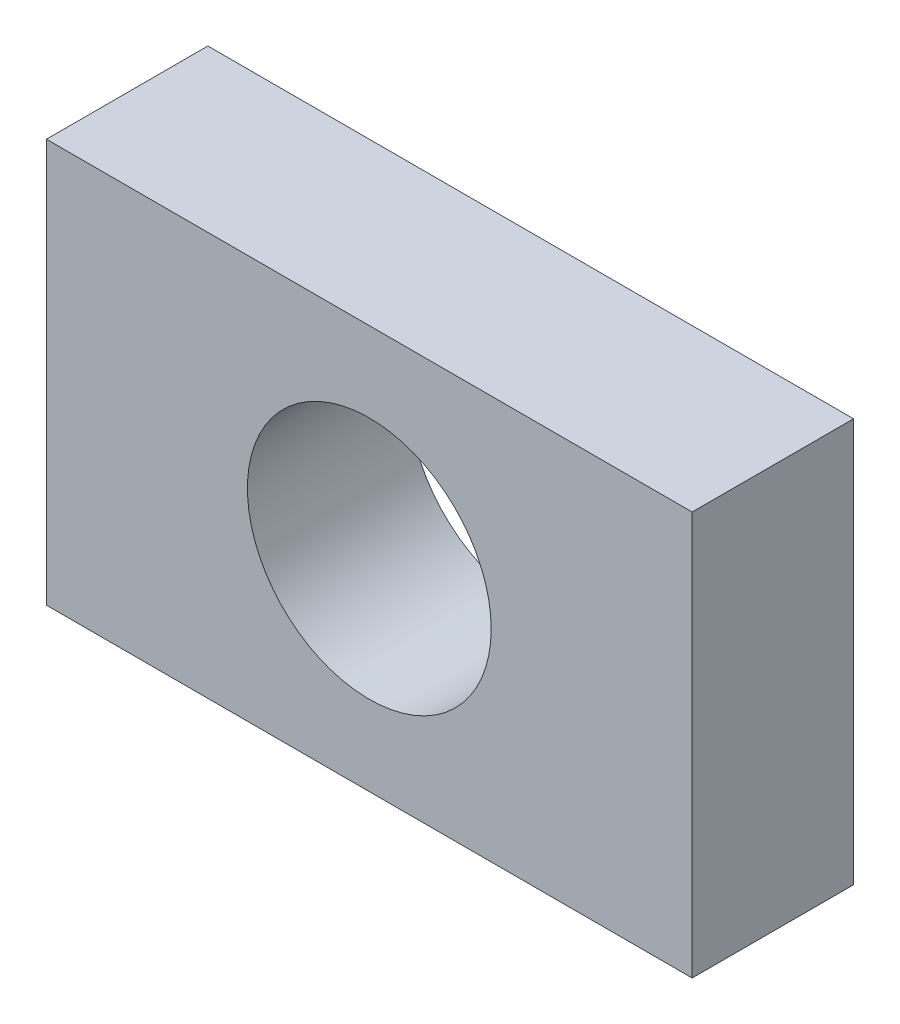
ISO-10303-21;
HEADER;
FILE_DESCRIPTION(('STEP AP214'),'2;1');
FILE_NAME('part.step','',(''),(''),'','','');
FILE_SCHEMA(('AUTOMOTIVE_DESIGN { 1 0 10303 214 1 1 1 1 }'));
ENDSEC;
DATA;
#1=APPLICATION_CONTEXT('core data for automotive mechanical design processes');
#2=APPLICATION_PROTOCOL_DEFINITION('international standard','automotive_design',2000,#1);
#3=PRODUCT_CONTEXT('',#1,'mechanical');
#4=PRODUCT('Part','Part','',(#3));
#5=PRODUCT_RELATED_PRODUCT_CATEGORY('part','',(#4));
#6=PRODUCT_DEFINITION_FORMATION('','',#4);
#7=PRODUCT_DEFINITION_CONTEXT('part definition',#1,'design');
#8=PRODUCT_DEFINITION('design','',#6,#7);
#9=PRODUCT_DEFINITION_SHAPE('','',#8);
#10=(LENGTH_UNIT() NAMED_UNIT(*) SI_UNIT(.MILLI.,.METRE.));
#11=(NAMED_UNIT(*) PLANE_ANGLE_UNIT() SI_UNIT($,.RADIAN.));
#12=(NAMED_UNIT(*) SI_UNIT($,.STERADIAN.) SOLID_ANGLE_UNIT());
#13=UNCERTAINTY_MEASURE_WITH_UNIT(LENGTH_MEASURE(1.E-05),#10,'distance_accuracy_value','');
#14=(GEOMETRIC_REPRESENTATION_CONTEXT(3) GLOBAL_UNCERTAINTY_ASSIGNED_CONTEXT((#13)) GLOBAL_UNIT_ASSIGNED_CONTEXT((#10,
#11,#12)) REPRESENTATION_CONTEXT('',''));
#15=CARTESIAN_POINT('',(0.,0.,0.));
#16=DIRECTION('',(0.,0.,1.));
#17=DIRECTION('',(1.,0.,0.));
#18=AXIS2_PLACEMENT_3D('',#15,#16,#17);
#19=CARTESIAN_POINT('',(0.,0.,10.));
#20=DIRECTION('',(0.,0.,-1.));
#21=DIRECTION('',(-1.,0.,0.));
#22=AXIS2_PLACEMENT_3D('',#19,#20,#21);
#23=PLANE('',#22);
#24=DIRECTION('',(0.,1.,0.));
#25=VECTOR('',#24,1.);
#26=CARTESIAN_POINT('',(40.,-25.,10.));
#27=LINE('',#26,#25);
#28=CARTESIAN_POINT('',(40.,-25.,10.));
#29=VERTEX_POINT('',#28);
#30=CARTESIAN_POINT('',(40.,25.,10.));
#31=VERTEX_POINT('',#30);
#32=EDGE_CURVE('E93',#29,#31,#27,.T.);
#33=ORIENTED_EDGE('',*,*,#32,.T.);
#34=DIRECTION('',(-1.,0.,0.));
#35=VECTOR('',#34,1.);
#36=CARTESIAN_POINT('',(-40.,25.,10.));
#37=LINE('',#36,#35);
#38=CARTESIAN_POINT('',(-40.,25.,10.));
#39=VERTEX_POINT('',#38);
#40=EDGE_CURVE('E86',#31,#39,#37,.T.);
#41=ORIENTED_EDGE('',*,*,#40,.T.);
#42=DIRECTION('',(0.,-1.,0.));
#43=VECTOR('',#42,1.);
#44=CARTESIAN_POINT('',(-40.,-25.,10.));
#45=LINE('',#44,#43);
#46=CARTESIAN_POINT('',(-40.,-25.,10.));
#47=VERTEX_POINT('',#46);
#48=EDGE_CURVE('E92',#39,#47,#45,.T.);
#49=ORIENTED_EDGE('',*,*,#48,.T.);
#50=DIRECTION('',(1.,0.,0.));
#51=VECTOR('',#50,1.);
#52=CARTESIAN_POINT('',(-40.,-25.,10.));
#53=LINE('',#52,#51);
#54=EDGE_CURVE('E59',#47,#29,#53,.T.);
#55=ORIENTED_EDGE('',*,*,#54,.T.);
#56=EDGE_LOOP('',(#33,#41,#49,#55));
#57=FACE_BOUND('',#56,.T.);
#58=CARTESIAN_POINT('',(0.,0.,10.));
#59=DIRECTION('',(0.,0.,1.));
#60=DIRECTION('',(1.,0.,0.));
#61=AXIS2_PLACEMENT_3D('',#58,#59,#60);
#62=CIRCLE('',#61,15.1);
#63=CARTESIAN_POINT('',(15.1,0.,10.));
#64=VERTEX_POINT('',#63);
#65=EDGE_CURVE('E108',#64,#64,#62,.T.);
#66=ORIENTED_EDGE('',*,*,#65,.F.);
#67=EDGE_LOOP('',(#66));
#68=FACE_BOUND('',#67,.T.);
#69=ADVANCED_FACE('F41',(#57,#68),#23,.F.);
#70=CARTESIAN_POINT('',(0.,0.,-10.));
#71=DIRECTION('',(0.,0.,-1.));
#72=DIRECTION('',(-1.,0.,0.));
#73=AXIS2_PLACEMENT_3D('',#70,#71,#72);
#74=PLANE('',#73);
#75=DIRECTION('',(0.,1.,0.));
#76=VECTOR('',#75,1.);
#77=CARTESIAN_POINT('',(40.,-25.,-10.));
#78=LINE('',#77,#76);
#79=CARTESIAN_POINT('',(40.,-25.,-10.));
#80=VERTEX_POINT('',#79);
#81=CARTESIAN_POINT('',(40.,25.,-10.));
#82=VERTEX_POINT('',#81);
#83=EDGE_CURVE('E102',#80,#82,#78,.T.);
#84=ORIENTED_EDGE('',*,*,#83,.F.);
#85=DIRECTION('',(1.,0.,0.));
#86=VECTOR('',#85,1.);
#87=CARTESIAN_POINT('',(-40.,-25.,-10.));
#88=LINE('',#87,#86);
#89=CARTESIAN_POINT('',(-40.,-25.,-10.));
#90=VERTEX_POINT('',#89);
#91=EDGE_CURVE('E82',#90,#80,#88,.T.);
#92=ORIENTED_EDGE('',*,*,#91,.F.);
#93=DIRECTION('',(0.,-1.,0.));
#94=VECTOR('',#93,1.);
#95=CARTESIAN_POINT('',(-40.,-25.,-10.));
#96=LINE('',#95,#94);
#97=CARTESIAN_POINT('',(-40.,25.,-10.));
#98=VERTEX_POINT('',#97);
#99=EDGE_CURVE('E71',#98,#90,#96,.T.);
#100=ORIENTED_EDGE('',*,*,#99,.F.);
#101=DIRECTION('',(-1.,0.,0.));
#102=VECTOR('',#101,1.);
#103=CARTESIAN_POINT('',(-40.,25.,-10.));
#104=LINE('',#103,#102);
#105=EDGE_CURVE('E97',#82,#98,#104,.T.);
#106=ORIENTED_EDGE('',*,*,#105,.F.);
#107=EDGE_LOOP('',(#84,#92,#100,#106));
#108=FACE_BOUND('',#107,.T.);
#109=CARTESIAN_POINT('',(0.,0.,-10.));
#110=DIRECTION('',(0.,0.,1.));
#111=DIRECTION('',(1.,0.,0.));
#112=AXIS2_PLACEMENT_3D('',#109,#110,#111);
#113=CIRCLE('',#112,15.1);
#114=CARTESIAN_POINT('',(15.1,0.,-10.));
#115=VERTEX_POINT('',#114);
#116=EDGE_CURVE('E119',#115,#115,#113,.T.);
#117=ORIENTED_EDGE('',*,*,#116,.T.);
#118=EDGE_LOOP('',(#117));
#119=FACE_BOUND('',#118,.T.);
#120=ADVANCED_FACE('F116',(#108,#119),#74,.T.);
#121=CARTESIAN_POINT('',(40.,-25.,10.));
#122=DIRECTION('',(-1.,0.,0.));
#123=DIRECTION('',(0.,0.,1.));
#124=AXIS2_PLACEMENT_3D('',#121,#122,#123);
#125=PLANE('',#124);
#126=ORIENTED_EDGE('',*,*,#83,.T.);
#127=DIRECTION('',(0.,0.,-1.));
#128=VECTOR('',#127,1.);
#129=CARTESIAN_POINT('',(40.,25.,10.));
#130=LINE('',#129,#128);
#131=EDGE_CURVE('E11',#31,#82,#130,.T.);
#132=ORIENTED_EDGE('',*,*,#131,.F.);
#133=ORIENTED_EDGE('',*,*,#32,.F.);
#134=DIRECTION('',(0.,0.,-1.));
#135=VECTOR('',#134,1.);
#136=CARTESIAN_POINT('',(40.,-25.,10.));
#137=LINE('',#136,#135);
#138=EDGE_CURVE('E103',#29,#80,#137,.T.);
#139=ORIENTED_EDGE('',*,*,#138,.T.);
#140=EDGE_LOOP('',(#126,#132,#133,#139));
#141=FACE_BOUND('',#140,.T.);
#142=ADVANCED_FACE('F43',(#141),#125,.F.);
#143=CARTESIAN_POINT('',(-40.,25.,10.));
#144=DIRECTION('',(0.,-1.,0.));
#145=DIRECTION('',(0.,0.,-1.));
#146=AXIS2_PLACEMENT_3D('',#143,#144,#145);
#147=PLANE('',#146);
#148=ORIENTED_EDGE('',*,*,#105,.T.);
#149=DIRECTION('',(0.,0.,-1.));
#150=VECTOR('',#149,1.);
#151=CARTESIAN_POINT('',(-40.,25.,10.));
#152=LINE('',#151,#150);
#153=EDGE_CURVE('E49',#39,#98,#152,.T.);
#154=ORIENTED_EDGE('',*,*,#153,.F.);
#155=ORIENTED_EDGE('',*,*,#40,.F.);
#156=ORIENTED_EDGE('',*,*,#131,.T.);
#157=EDGE_LOOP('',(#148,#154,#155,#156));
#158=FACE_BOUND('',#157,.T.);
#159=ADVANCED_FACE('F98',(#158),#147,.F.);
#160=CARTESIAN_POINT('',(-40.,-25.,10.));
#161=DIRECTION('',(1.,0.,0.));
#162=DIRECTION('',(0.,0.,-1.));
#163=AXIS2_PLACEMENT_3D('',#160,#161,#162);
#164=PLANE('',#163);
#165=ORIENTED_EDGE('',*,*,#99,.T.);
#166=DIRECTION('',(0.,0.,-1.));
#167=VECTOR('',#166,1.);
#168=CARTESIAN_POINT('',(-40.,-25.,10.));
#169=LINE('',#168,#167);
#170=EDGE_CURVE('E96',#47,#90,#169,.T.);
#171=ORIENTED_EDGE('',*,*,#170,.F.);
#172=ORIENTED_EDGE('',*,*,#48,.F.);
#173=ORIENTED_EDGE('',*,*,#153,.T.);
#174=EDGE_LOOP('',(#165,#171,#172,#173));
#175=FACE_BOUND('',#174,.T.);
#176=ADVANCED_FACE('F100',(#175),#164,.F.);
#177=CARTESIAN_POINT('',(-40.,-25.,10.));
#178=DIRECTION('',(0.,1.,0.));
#179=DIRECTION('',(0.,0.,1.));
#180=AXIS2_PLACEMENT_3D('',#177,#178,#179);
#181=PLANE('',#180);
#182=ORIENTED_EDGE('',*,*,#91,.T.);
#183=ORIENTED_EDGE('',*,*,#138,.F.);
#184=ORIENTED_EDGE('',*,*,#54,.F.);
#185=ORIENTED_EDGE('',*,*,#170,.T.);
#186=EDGE_LOOP('',(#182,#183,#184,#185));
#187=FACE_BOUND('',#186,.T.);
#188=ADVANCED_FACE('F113',(#187),#181,.F.);
#189=CARTESIAN_POINT('',(0.,0.,10.));
#190=DIRECTION('',(0.,0.,-1.));
#191=DIRECTION('',(-1.,0.,0.));
#192=AXIS2_PLACEMENT_3D('',#189,#190,#191);
#193=CYLINDRICAL_SURFACE('',#192,15.1);
#194=ORIENTED_EDGE('',*,*,#65,.T.);
#195=EDGE_LOOP('',(#194));
#196=FACE_BOUND('',#195,.T.);
#197=ORIENTED_EDGE('',*,*,#116,.F.);
#198=EDGE_LOOP('',(#197));
#199=FACE_BOUND('',#198,.T.);
#200=ADVANCED_FACE('F127',(#196,#199),#193,.F.);
#201=CLOSED_SHELL('',(#69,#120,#142,#159,#176,#188,#200));
#202=MANIFOLD_SOLID_BREP('B2',#201);
#203=ADVANCED_BREP_SHAPE_REPRESENTATION('',(#18,#202),#14);
#204=SHAPE_DEFINITION_REPRESENTATION(#9,#203);
ENDSEC;
END-ISO-10303-21;
